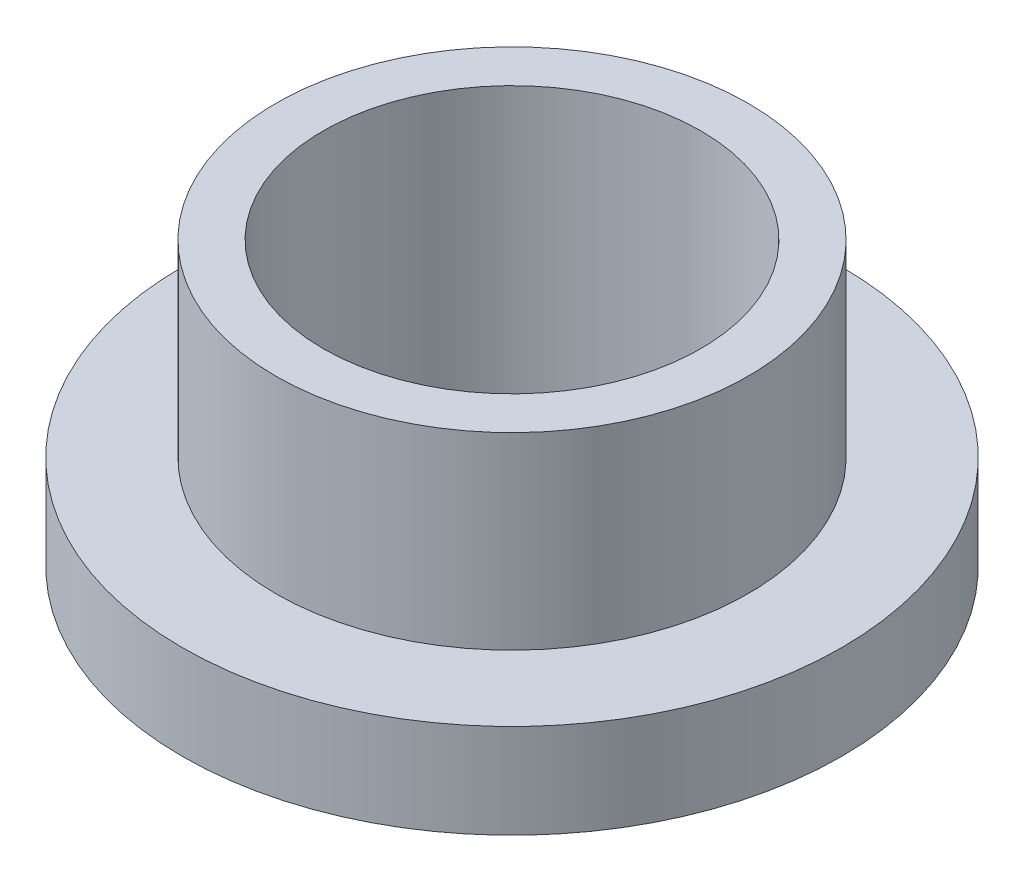
ISO-10303-21;
HEADER;
FILE_DESCRIPTION(('STEP AP214'),'2;1');
FILE_NAME('part.step','',(''),(''),'','','');
FILE_SCHEMA(('AUTOMOTIVE_DESIGN { 1 0 10303 214 1 1 1 1 }'));
ENDSEC;
DATA;
#1=APPLICATION_CONTEXT('core data for automotive mechanical design processes');
#2=APPLICATION_PROTOCOL_DEFINITION('international standard','automotive_design',2000,#1);
#3=PRODUCT_CONTEXT('',#1,'mechanical');
#4=PRODUCT('Part','Part','',(#3));
#5=PRODUCT_RELATED_PRODUCT_CATEGORY('part','',(#4));
#6=PRODUCT_DEFINITION_FORMATION('','',#4);
#7=PRODUCT_DEFINITION_CONTEXT('part definition',#1,'design');
#8=PRODUCT_DEFINITION('design','',#6,#7);
#9=PRODUCT_DEFINITION_SHAPE('','',#8);
#10=(LENGTH_UNIT() NAMED_UNIT(*) SI_UNIT(.MILLI.,.METRE.));
#11=(NAMED_UNIT(*) PLANE_ANGLE_UNIT() SI_UNIT($,.RADIAN.));
#12=(NAMED_UNIT(*) SI_UNIT($,.STERADIAN.) SOLID_ANGLE_UNIT());
#13=UNCERTAINTY_MEASURE_WITH_UNIT(LENGTH_MEASURE(1.E-05),#10,'distance_accuracy_value','');
#14=(GEOMETRIC_REPRESENTATION_CONTEXT(3) GLOBAL_UNCERTAINTY_ASSIGNED_CONTEXT((#13)) GLOBAL_UNIT_ASSIGNED_CONTEXT((#10,
#11,#12)) REPRESENTATION_CONTEXT('',''));
#15=CARTESIAN_POINT('',(0.,0.,0.));
#16=DIRECTION('',(0.,0.,1.));
#17=DIRECTION('',(1.,0.,0.));
#18=AXIS2_PLACEMENT_3D('',#15,#16,#17);
#19=CARTESIAN_POINT('',(0.,9.525,0.));
#20=DIRECTION('',(0.,1.,0.));
#21=DIRECTION('',(0.,0.,1.));
#22=AXIS2_PLACEMENT_3D('',#19,#20,#21);
#23=PLANE('',#22);
#24=CARTESIAN_POINT('',(0.,9.525,0.));
#25=DIRECTION('',(0.,1.,0.));
#26=DIRECTION('',(0.,0.,1.));
#27=AXIS2_PLACEMENT_3D('',#24,#25,#26);
#28=CIRCLE('',#27,7.9629);
#29=CARTESIAN_POINT('',(0.,9.525,-7.9629));
#30=VERTEX_POINT('',#29);
#31=EDGE_CURVE('E10',#30,#30,#28,.T.);
#32=ORIENTED_EDGE('',*,*,#31,.T.);
#33=EDGE_LOOP('',(#32));
#34=FACE_BOUND('',#33,.T.);
#35=CARTESIAN_POINT('',(0.,9.525,0.));
#36=DIRECTION('',(0.,1.,0.));
#37=DIRECTION('',(0.,0.,1.));
#38=AXIS2_PLACEMENT_3D('',#35,#36,#37);
#39=CIRCLE('',#38,6.3627);
#40=CARTESIAN_POINT('',(0.,9.525,-6.3627));
#41=VERTEX_POINT('',#40);
#42=EDGE_CURVE('E37',#41,#41,#39,.T.);
#43=ORIENTED_EDGE('',*,*,#42,.F.);
#44=EDGE_LOOP('',(#43));
#45=FACE_BOUND('',#44,.T.);
#46=ADVANCED_FACE('F30',(#34,#45),#23,.T.);
#47=CARTESIAN_POINT('',(0.,0.,0.));
#48=DIRECTION('',(0.,1.,0.));
#49=DIRECTION('',(0.,0.,1.));
#50=AXIS2_PLACEMENT_3D('',#47,#48,#49);
#51=PLANE('',#50);
#52=CARTESIAN_POINT('',(0.,0.,0.));
#53=DIRECTION('',(0.,1.,0.));
#54=DIRECTION('',(0.,0.,1.));
#55=AXIS2_PLACEMENT_3D('',#52,#53,#54);
#56=CIRCLE('',#55,6.3627);
#57=CARTESIAN_POINT('',(0.,0.,-6.3627));
#58=VERTEX_POINT('',#57);
#59=EDGE_CURVE('E41',#58,#58,#56,.T.);
#60=ORIENTED_EDGE('',*,*,#59,.T.);
#61=EDGE_LOOP('',(#60));
#62=FACE_BOUND('',#61,.T.);
#63=CARTESIAN_POINT('',(0.,0.,0.));
#64=DIRECTION('',(0.,1.,0.));
#65=DIRECTION('',(0.,0.,1.));
#66=AXIS2_PLACEMENT_3D('',#63,#64,#65);
#67=CIRCLE('',#66,11.1125);
#68=CARTESIAN_POINT('',(0.,0.,11.1125));
#69=VERTEX_POINT('',#68);
#70=EDGE_CURVE('E48',#69,#69,#67,.T.);
#71=ORIENTED_EDGE('',*,*,#70,.F.);
#72=EDGE_LOOP('',(#71));
#73=FACE_BOUND('',#72,.T.);
#74=ADVANCED_FACE('F73',(#62,#73),#51,.F.);
#75=CARTESIAN_POINT('',(0.,9.525,0.));
#76=DIRECTION('',(0.,-1.,0.));
#77=DIRECTION('',(0.,0.,-1.));
#78=AXIS2_PLACEMENT_3D('',#75,#76,#77);
#79=CYLINDRICAL_SURFACE('',#78,7.9629);
#80=CARTESIAN_POINT('',(0.,3.175,0.));
#81=DIRECTION('',(0.,1.,0.));
#82=DIRECTION('',(0.,0.,1.));
#83=AXIS2_PLACEMENT_3D('',#80,#81,#82);
#84=CIRCLE('',#83,7.9629);
#85=CARTESIAN_POINT('',(0.,3.175,-7.9629));
#86=VERTEX_POINT('',#85);
#87=EDGE_CURVE('E51',#86,#86,#84,.T.);
#88=CARTESIAN_POINT('',(0.,3.175,-7.9629));
#89=CARTESIAN_POINT('',(0.,3.24114583333333,-7.9629));
#90=CARTESIAN_POINT('',(0.,3.30729166666667,-7.9629));
#91=CARTESIAN_POINT('',(0.,3.43958333333333,-7.9629));
#92=CARTESIAN_POINT('',(0.,3.50572916666667,-7.9629));
#93=CARTESIAN_POINT('',(0.,3.63802083333333,-7.9629));
#94=CARTESIAN_POINT('',(0.,3.70416666666667,-7.9629));
#95=CARTESIAN_POINT('',(0.,3.83645833333333,-7.9629));
#96=CARTESIAN_POINT('',(0.,3.90260416666667,-7.9629));
#97=CARTESIAN_POINT('',(0.,4.03489583333333,-7.9629));
#98=CARTESIAN_POINT('',(0.,4.10104166666667,-7.9629));
#99=CARTESIAN_POINT('',(0.,4.23333333333333,-7.9629));
#100=CARTESIAN_POINT('',(0.,4.29947916666667,-7.9629));
#101=CARTESIAN_POINT('',(0.,4.43177083333333,-7.9629));
#102=CARTESIAN_POINT('',(0.,4.49791666666667,-7.9629));
#103=CARTESIAN_POINT('',(0.,4.63020833333333,-7.9629));
#104=CARTESIAN_POINT('',(0.,4.69635416666667,-7.9629));
#105=CARTESIAN_POINT('',(0.,4.82864583333333,-7.9629));
#106=CARTESIAN_POINT('',(0.,4.89479166666667,-7.9629));
#107=CARTESIAN_POINT('',(0.,5.02708333333333,-7.9629));
#108=CARTESIAN_POINT('',(0.,5.09322916666667,-7.9629));
#109=CARTESIAN_POINT('',(0.,5.22552083333333,-7.9629));
#110=CARTESIAN_POINT('',(0.,5.29166666666667,-7.9629));
#111=CARTESIAN_POINT('',(0.,5.42395833333333,-7.9629));
#112=CARTESIAN_POINT('',(0.,5.49010416666667,-7.9629));
#113=CARTESIAN_POINT('',(0.,5.62239583333333,-7.9629));
#114=CARTESIAN_POINT('',(0.,5.68854166666667,-7.9629));
#115=CARTESIAN_POINT('',(0.,5.82083333333333,-7.9629));
#116=CARTESIAN_POINT('',(0.,5.88697916666667,-7.9629));
#117=CARTESIAN_POINT('',(0.,6.01927083333333,-7.9629));
#118=CARTESIAN_POINT('',(0.,6.08541666666667,-7.9629));
#119=CARTESIAN_POINT('',(0.,6.21770833333333,-7.9629));
#120=CARTESIAN_POINT('',(0.,6.28385416666667,-7.9629));
#121=CARTESIAN_POINT('',(0.,6.41614583333333,-7.9629));
#122=CARTESIAN_POINT('',(0.,6.48229166666667,-7.9629));
#123=CARTESIAN_POINT('',(0.,6.61458333333333,-7.9629));
#124=CARTESIAN_POINT('',(0.,6.68072916666667,-7.9629));
#125=CARTESIAN_POINT('',(0.,6.81302083333333,-7.9629));
#126=CARTESIAN_POINT('',(0.,6.87916666666667,-7.9629));
#127=CARTESIAN_POINT('',(0.,7.01145833333333,-7.9629));
#128=CARTESIAN_POINT('',(0.,7.07760416666667,-7.9629));
#129=CARTESIAN_POINT('',(0.,7.20989583333333,-7.9629));
#130=CARTESIAN_POINT('',(0.,7.27604166666667,-7.9629));
#131=CARTESIAN_POINT('',(0.,7.40833333333333,-7.9629));
#132=CARTESIAN_POINT('',(0.,7.47447916666667,-7.9629));
#133=CARTESIAN_POINT('',(0.,7.60677083333333,-7.9629));
#134=CARTESIAN_POINT('',(0.,7.67291666666667,-7.9629));
#135=CARTESIAN_POINT('',(0.,7.80520833333333,-7.9629));
#136=CARTESIAN_POINT('',(0.,7.87135416666667,-7.9629));
#137=CARTESIAN_POINT('',(0.,8.00364583333333,-7.9629));
#138=CARTESIAN_POINT('',(0.,8.06979166666667,-7.9629));
#139=CARTESIAN_POINT('',(0.,8.20208333333333,-7.9629));
#140=CARTESIAN_POINT('',(0.,8.26822916666667,-7.9629));
#141=CARTESIAN_POINT('',(0.,8.40052083333333,-7.9629));
#142=CARTESIAN_POINT('',(0.,8.46666666666667,-7.9629));
#143=CARTESIAN_POINT('',(0.,8.59895833333333,-7.9629));
#144=CARTESIAN_POINT('',(0.,8.66510416666667,-7.9629));
#145=CARTESIAN_POINT('',(0.,8.79739583333333,-7.9629));
#146=CARTESIAN_POINT('',(0.,8.86354166666667,-7.9629));
#147=CARTESIAN_POINT('',(0.,8.99583333333333,-7.9629));
#148=CARTESIAN_POINT('',(0.,9.06197916666667,-7.9629));
#149=CARTESIAN_POINT('',(0.,9.19427083333333,-7.9629));
#150=CARTESIAN_POINT('',(0.,9.26041666666667,-7.9629));
#151=CARTESIAN_POINT('',(0.,9.39270833333333,-7.9629));
#152=CARTESIAN_POINT('',(0.,9.45885416666667,-7.9629));
#153=CARTESIAN_POINT('',(0.,9.525,-7.9629));
#154=B_SPLINE_CURVE_WITH_KNOTS('',3,(#88,#89,#90,#91,#92,#93,#94,#95,#96,#97,#98,#99,#100,#101,
#102,#103,#104,#105,#106,#107,#108,#109,#110,#111,#112,#113,#114,#115,#116,#117,#118,#119,#120,
#121,#122,#123,#124,#125,#126,#127,#128,#129,#130,#131,#132,#133,#134,#135,#136,#137,#138,#139,
#140,#141,#142,#143,#144,#145,#146,#147,#148,#149,#150,#151,#152,#153),.UNSPECIFIED.,.F.,.F.,(4,
2,2,2,2,2,2,2,2,2,2,2,2,2,2,2,2,2,2,2,2,2,2,2,2,2,2,2,2,2,2,2,4),(0.,0.1984375,0.396875,
0.5953125,0.79375,0.9921875,1.190625,1.3890625,1.5875,1.7859375,1.984375,2.1828125,2.38125,
2.5796875,2.778125,2.9765625,3.175,3.3734375,3.571875,3.7703125,3.96875,4.1671875,4.365625,
4.5640625,4.7625,4.9609375,5.159375,5.3578125,5.55625,5.7546875,5.953125,6.1515625,6.35),.UNSPECIFIED.);
#155=EDGE_CURVE('BSEAM32',#86,#30,#154,.T.);
#156=ORIENTED_EDGE('',*,*,#87,.T.);
#157=ORIENTED_EDGE('',*,*,#31,.F.);
#158=ORIENTED_EDGE('',*,*,#155,.T.);
#159=ORIENTED_EDGE('',*,*,#155,.F.);
#160=EDGE_LOOP('',(#156,#158,#157,#159));
#161=FACE_BOUND('',#160,.T.);
#162=ADVANCED_FACE('F32',(#161),#79,.T.);
#163=CARTESIAN_POINT('',(0.,9.525,0.));
#164=DIRECTION('',(0.,-1.,0.));
#165=DIRECTION('',(0.,0.,-1.));
#166=AXIS2_PLACEMENT_3D('',#163,#164,#165);
#167=CYLINDRICAL_SURFACE('',#166,6.3627);
#168=CARTESIAN_POINT('',(0.,9.525,-6.3627));
#169=CARTESIAN_POINT('',(0.,9.42578125,-6.3627));
#170=CARTESIAN_POINT('',(0.,9.3265625,-6.3627));
#171=CARTESIAN_POINT('',(0.,9.128125,-6.3627));
#172=CARTESIAN_POINT('',(0.,9.02890625,-6.3627));
#173=CARTESIAN_POINT('',(0.,8.83046875,-6.3627));
#174=CARTESIAN_POINT('',(0.,8.73125,-6.3627));
#175=CARTESIAN_POINT('',(0.,8.5328125,-6.3627));
#176=CARTESIAN_POINT('',(0.,8.43359375,-6.3627));
#177=CARTESIAN_POINT('',(0.,8.23515625,-6.3627));
#178=CARTESIAN_POINT('',(0.,8.1359375,-6.3627));
#179=CARTESIAN_POINT('',(0.,7.9375,-6.3627));
#180=CARTESIAN_POINT('',(0.,7.83828125,-6.3627));
#181=CARTESIAN_POINT('',(0.,7.63984375,-6.3627));
#182=CARTESIAN_POINT('',(0.,7.540625,-6.3627));
#183=CARTESIAN_POINT('',(0.,7.3421875,-6.3627));
#184=CARTESIAN_POINT('',(0.,7.24296875,-6.3627));
#185=CARTESIAN_POINT('',(0.,7.04453125,-6.3627));
#186=CARTESIAN_POINT('',(0.,6.9453125,-6.3627));
#187=CARTESIAN_POINT('',(0.,6.746875,-6.3627));
#188=CARTESIAN_POINT('',(0.,6.64765625,-6.3627));
#189=CARTESIAN_POINT('',(0.,6.44921875,-6.3627));
#190=CARTESIAN_POINT('',(0.,6.35,-6.3627));
#191=CARTESIAN_POINT('',(0.,6.1515625,-6.3627));
#192=CARTESIAN_POINT('',(0.,6.05234375,-6.3627));
#193=CARTESIAN_POINT('',(0.,5.85390625,-6.3627));
#194=CARTESIAN_POINT('',(0.,5.7546875,-6.3627));
#195=CARTESIAN_POINT('',(0.,5.55625,-6.3627));
#196=CARTESIAN_POINT('',(0.,5.45703125,-6.3627));
#197=CARTESIAN_POINT('',(0.,5.25859375,-6.3627));
#198=CARTESIAN_POINT('',(0.,5.159375,-6.3627));
#199=CARTESIAN_POINT('',(0.,4.9609375,-6.3627));
#200=CARTESIAN_POINT('',(0.,4.86171875,-6.3627));
#201=CARTESIAN_POINT('',(0.,4.66328125,-6.3627));
#202=CARTESIAN_POINT('',(0.,4.5640625,-6.3627));
#203=CARTESIAN_POINT('',(0.,4.365625,-6.3627));
#204=CARTESIAN_POINT('',(0.,4.26640625,-6.3627));
#205=CARTESIAN_POINT('',(0.,4.06796875,-6.3627));
#206=CARTESIAN_POINT('',(0.,3.96875,-6.3627));
#207=CARTESIAN_POINT('',(0.,3.7703125,-6.3627));
#208=CARTESIAN_POINT('',(0.,3.67109375,-6.3627));
#209=CARTESIAN_POINT('',(0.,3.47265625,-6.3627));
#210=CARTESIAN_POINT('',(0.,3.3734375,-6.3627));
#211=CARTESIAN_POINT('',(0.,3.175,-6.3627));
#212=CARTESIAN_POINT('',(0.,3.07578125,-6.3627));
#213=CARTESIAN_POINT('',(0.,2.87734375,-6.3627));
#214=CARTESIAN_POINT('',(0.,2.778125,-6.3627));
#215=CARTESIAN_POINT('',(0.,2.5796875,-6.3627));
#216=CARTESIAN_POINT('',(0.,2.48046875,-6.3627));
#217=CARTESIAN_POINT('',(0.,2.28203125,-6.3627));
#218=CARTESIAN_POINT('',(0.,2.1828125,-6.3627));
#219=CARTESIAN_POINT('',(0.,1.984375,-6.3627));
#220=CARTESIAN_POINT('',(0.,1.88515625,-6.3627));
#221=CARTESIAN_POINT('',(0.,1.68671875,-6.3627));
#222=CARTESIAN_POINT('',(0.,1.5875,-6.3627));
#223=CARTESIAN_POINT('',(0.,1.3890625,-6.3627));
#224=CARTESIAN_POINT('',(0.,1.28984375,-6.3627));
#225=CARTESIAN_POINT('',(0.,1.09140625,-6.3627));
#226=CARTESIAN_POINT('',(0.,0.992187500000001,-6.3627));
#227=CARTESIAN_POINT('',(0.,0.793750000000001,-6.3627));
#228=CARTESIAN_POINT('',(0.,0.69453125,-6.3627));
#229=CARTESIAN_POINT('',(0.,0.49609375,-6.3627));
#230=CARTESIAN_POINT('',(0.,0.396875,-6.3627));
#231=CARTESIAN_POINT('',(0.,0.1984375,-6.3627));
#232=CARTESIAN_POINT('',(0.,0.0992187500000001,-6.3627));
#233=CARTESIAN_POINT('',(0.,0.,-6.3627));
#234=B_SPLINE_CURVE_WITH_KNOTS('',3,(#168,#169,#170,#171,#172,#173,#174,#175,#176,#177,#178,
#179,#180,#181,#182,#183,#184,#185,#186,#187,#188,#189,#190,#191,#192,#193,#194,#195,#196,#197,
#198,#199,#200,#201,#202,#203,#204,#205,#206,#207,#208,#209,#210,#211,#212,#213,#214,#215,#216,
#217,#218,#219,#220,#221,#222,#223,#224,#225,#226,#227,#228,#229,#230,#231,#232,#233),
.UNSPECIFIED.,.F.,.F.,(4,2,2,2,2,2,2,2,2,2,2,2,2,2,2,2,2,2,2,2,2,2,2,2,2,2,2,2,2,2,2,2,4),(0.,
0.29765625,0.5953125,0.892968750000001,1.190625,1.48828125,1.7859375,2.08359375,2.38125,
2.67890625,2.9765625,3.27421875,3.571875,3.86953125,4.1671875,4.46484375,4.7625,5.06015625,
5.3578125,5.65546875,5.953125,6.25078125,6.5484375,6.84609375,7.14375,7.44140625,7.7390625,
8.03671875,8.334375,8.63203125,8.9296875,9.22734375,9.525),.UNSPECIFIED.);
#235=EDGE_CURVE('BSEAM62',#41,#58,#234,.T.);
#236=ORIENTED_EDGE('',*,*,#42,.T.);
#237=ORIENTED_EDGE('',*,*,#59,.F.);
#238=ORIENTED_EDGE('',*,*,#235,.T.);
#239=ORIENTED_EDGE('',*,*,#235,.F.);
#240=EDGE_LOOP('',(#236,#238,#237,#239));
#241=FACE_BOUND('',#240,.T.);
#242=ADVANCED_FACE('F62',(#241),#167,.F.);
#243=CARTESIAN_POINT('',(0.,3.175,0.));
#244=DIRECTION('',(0.,1.,0.));
#245=DIRECTION('',(0.,0.,1.));
#246=AXIS2_PLACEMENT_3D('',#243,#244,#245);
#247=PLANE('',#246);
#248=CARTESIAN_POINT('',(0.,3.175,0.));
#249=DIRECTION('',(0.,1.,0.));
#250=DIRECTION('',(0.,0.,1.));
#251=AXIS2_PLACEMENT_3D('',#248,#249,#250);
#252=CIRCLE('',#251,11.1125);
#253=CARTESIAN_POINT('',(0.,3.175,11.1125));
#254=VERTEX_POINT('',#253);
#255=EDGE_CURVE('E46',#254,#254,#252,.T.);
#256=ORIENTED_EDGE('',*,*,#255,.T.);
#257=EDGE_LOOP('',(#256));
#258=FACE_BOUND('',#257,.T.);
#259=ORIENTED_EDGE('',*,*,#87,.F.);
#260=EDGE_LOOP('',(#259));
#261=FACE_BOUND('',#260,.T.);
#262=ADVANCED_FACE('F59',(#258,#261),#247,.T.);
#263=CARTESIAN_POINT('',(0.,3.175,0.));
#264=DIRECTION('',(0.,-1.,0.));
#265=DIRECTION('',(0.,0.,-1.));
#266=AXIS2_PLACEMENT_3D('',#263,#264,#265);
#267=CYLINDRICAL_SURFACE('',#266,11.1125);
#268=ORIENTED_EDGE('',*,*,#255,.F.);
#269=EDGE_LOOP('',(#268));
#270=FACE_BOUND('',#269,.T.);
#271=ORIENTED_EDGE('',*,*,#70,.T.);
#272=EDGE_LOOP('',(#271));
#273=FACE_BOUND('',#272,.T.);
#274=ADVANCED_FACE('F61',(#270,#273),#267,.T.);
#275=CLOSED_SHELL('',(#46,#74,#162,#242,#262,#274));
#276=MANIFOLD_SOLID_BREP('B2',#275);
#277=ADVANCED_BREP_SHAPE_REPRESENTATION('',(#18,#276),#14);
#278=SHAPE_DEFINITION_REPRESENTATION(#9,#277);
ENDSEC;
END-ISO-10303-21;
